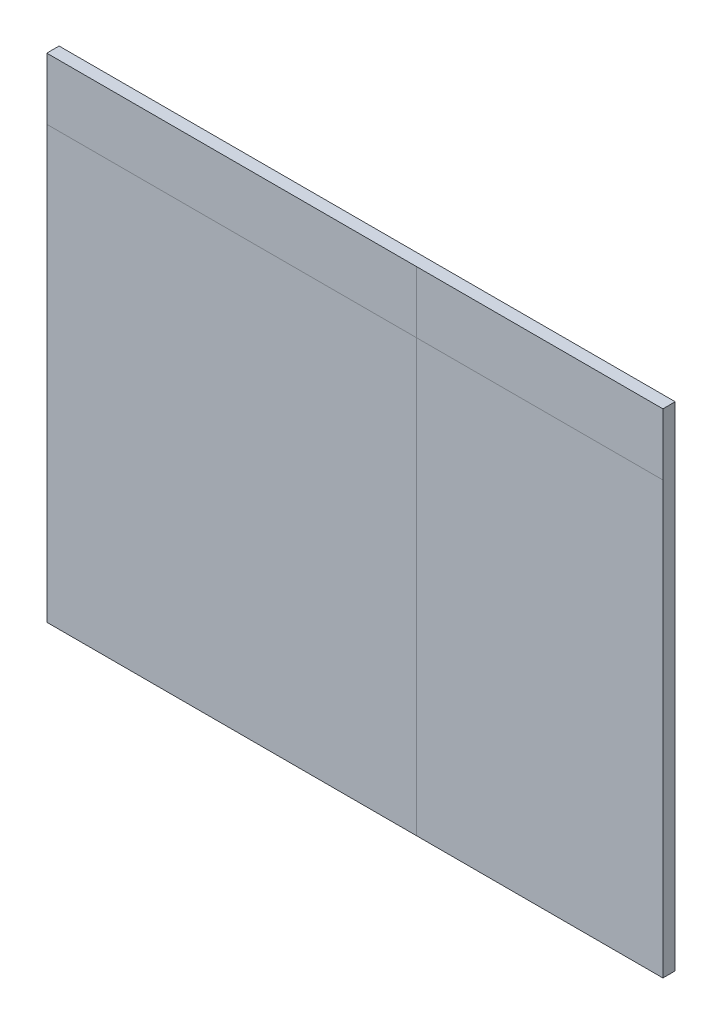
ISO-10303-21;
HEADER;
FILE_DESCRIPTION(('STEP AP214'),'2;1');
FILE_NAME('part.step','',(''),(''),'','','');
FILE_SCHEMA(('AUTOMOTIVE_DESIGN { 1 0 10303 214 1 1 1 1 }'));
ENDSEC;
DATA;
#1=APPLICATION_CONTEXT('core data for automotive mechanical design processes');
#2=APPLICATION_PROTOCOL_DEFINITION('international standard','automotive_design',2000,#1);
#3=PRODUCT_CONTEXT('',#1,'mechanical');
#4=PRODUCT('Part','Part','',(#3));
#5=PRODUCT_RELATED_PRODUCT_CATEGORY('part','',(#4));
#6=PRODUCT_DEFINITION_FORMATION('','',#4);
#7=PRODUCT_DEFINITION_CONTEXT('part definition',#1,'design');
#8=PRODUCT_DEFINITION('design','',#6,#7);
#9=PRODUCT_DEFINITION_SHAPE('','',#8);
#10=(LENGTH_UNIT() NAMED_UNIT(*) SI_UNIT(.MILLI.,.METRE.));
#11=(NAMED_UNIT(*) PLANE_ANGLE_UNIT() SI_UNIT($,.RADIAN.));
#12=(NAMED_UNIT(*) SI_UNIT($,.STERADIAN.) SOLID_ANGLE_UNIT());
#13=UNCERTAINTY_MEASURE_WITH_UNIT(LENGTH_MEASURE(1.E-05),#10,'distance_accuracy_value','');
#14=(GEOMETRIC_REPRESENTATION_CONTEXT(3) GLOBAL_UNCERTAINTY_ASSIGNED_CONTEXT((#13)) GLOBAL_UNIT_ASSIGNED_CONTEXT((#10,
#11,#12)) REPRESENTATION_CONTEXT('',''));
#15=CARTESIAN_POINT('',(0.,0.,0.));
#16=DIRECTION('',(0.,0.,1.));
#17=DIRECTION('',(1.,0.,0.));
#18=AXIS2_PLACEMENT_3D('',#15,#16,#17);
#19=CARTESIAN_POINT('',(-200000.,84553.4737983322,4000.));
#20=DIRECTION('',(0.,0.,1.));
#21=DIRECTION('',(1.,0.,0.));
#22=AXIS2_PLACEMENT_3D('',#19,#20,#21);
#23=PLANE('',#22);
#24=DIRECTION('',(0.,1.,0.));
#25=VECTOR('',#24,1.);
#26=CARTESIAN_POINT('',(8.5265128291212E-11,-75446.5262016678,4000.));
#27=LINE('',#26,#25);
#28=CARTESIAN_POINT('',(8.5265128291212E-11,-75446.5262016678,4000.));
#29=VERTEX_POINT('',#28);
#30=CARTESIAN_POINT('',(8.5265128291212E-11,64553.4738,4000.));
#31=VERTEX_POINT('',#30);
#32=EDGE_CURVE('E139',#29,#31,#27,.T.);
#33=ORIENTED_EDGE('',*,*,#32,.T.);
#34=DIRECTION('',(-1.,0.,0.));
#35=VECTOR('',#34,1.);
#36=CARTESIAN_POINT('',(-200000.,64553.4738,4000.));
#37=LINE('',#36,#35);
#38=CARTESIAN_POINT('',(-80000.,64553.4738,4000.));
#39=VERTEX_POINT('',#38);
#40=EDGE_CURVE('E11',#31,#39,#37,.T.);
#41=ORIENTED_EDGE('',*,*,#40,.T.);
#42=DIRECTION('',(0.,1.,0.));
#43=VECTOR('',#42,1.);
#44=CARTESIAN_POINT('',(-80000.,84553.4737983322,4000.));
#45=LINE('',#44,#43);
#46=CARTESIAN_POINT('',(-80000.,-75446.5262016678,4000.));
#47=VERTEX_POINT('',#46);
#48=EDGE_CURVE('E120',#47,#39,#45,.T.);
#49=ORIENTED_EDGE('',*,*,#48,.F.);
#50=DIRECTION('',(1.,0.,0.));
#51=VECTOR('',#50,1.);
#52=CARTESIAN_POINT('',(8.5265128291212E-11,-75446.5262016678,4000.));
#53=LINE('',#52,#51);
#54=EDGE_CURVE('E110',#47,#29,#53,.T.);
#55=ORIENTED_EDGE('',*,*,#54,.T.);
#56=EDGE_LOOP('',(#33,#41,#49,#55));
#57=FACE_BOUND('',#56,.T.);
#58=ADVANCED_FACE('F39',(#57),#23,.T.);
#59=ORIENTED_EDGE('',*,*,#48,.T.);
#60=DIRECTION('',(-1.,0.,0.));
#61=VECTOR('',#60,1.);
#62=CARTESIAN_POINT('',(-200000.,64553.4738,4000.));
#63=LINE('',#62,#61);
#64=CARTESIAN_POINT('',(-200000.,64553.4738,4000.));
#65=VERTEX_POINT('',#64);
#66=EDGE_CURVE('E43',#39,#65,#63,.T.);
#67=ORIENTED_EDGE('',*,*,#66,.T.);
#68=DIRECTION('',(0.,-1.,0.));
#69=VECTOR('',#68,1.);
#70=CARTESIAN_POINT('',(-200000.,-75446.5262016678,4000.));
#71=LINE('',#70,#69);
#72=CARTESIAN_POINT('',(-200000.,-75446.5262016678,4000.));
#73=VERTEX_POINT('',#72);
#74=EDGE_CURVE('E92',#65,#73,#71,.T.);
#75=ORIENTED_EDGE('',*,*,#74,.T.);
#76=EDGE_CURVE('E95',#73,#47,#53,.T.);
#77=ORIENTED_EDGE('',*,*,#76,.T.);
#78=EDGE_LOOP('',(#59,#67,#75,#77));
#79=FACE_BOUND('',#78,.T.);
#80=ADVANCED_FACE('F94',(#79),#23,.T.);
#81=ORIENTED_EDGE('',*,*,#66,.F.);
#82=CARTESIAN_POINT('',(-80000.,84553.4737983322,4000.));
#83=VERTEX_POINT('',#82);
#84=EDGE_CURVE('E116',#39,#83,#45,.T.);
#85=ORIENTED_EDGE('',*,*,#84,.T.);
#86=DIRECTION('',(-1.,0.,0.));
#87=VECTOR('',#86,1.);
#88=CARTESIAN_POINT('',(8.5265128291212E-11,84553.4737983322,4000.));
#89=LINE('',#88,#87);
#90=CARTESIAN_POINT('',(-200000.,84553.4737983322,4000.));
#91=VERTEX_POINT('',#90);
#92=EDGE_CURVE('E151',#83,#91,#89,.T.);
#93=ORIENTED_EDGE('',*,*,#92,.T.);
#94=EDGE_CURVE('E100',#91,#65,#71,.T.);
#95=ORIENTED_EDGE('',*,*,#94,.T.);
#96=EDGE_LOOP('',(#81,#85,#93,#95));
#97=FACE_BOUND('',#96,.T.);
#98=ADVANCED_FACE('F141',(#97),#23,.T.);
#99=CARTESIAN_POINT('',(-200000.,-75446.5262016678,4000.));
#100=DIRECTION('',(1.,0.,0.));
#101=DIRECTION('',(0.,1.,0.));
#102=AXIS2_PLACEMENT_3D('',#99,#100,#101);
#103=PLANE('',#102);
#104=DIRECTION('',(0.,-1.,0.));
#105=VECTOR('',#104,1.);
#106=CARTESIAN_POINT('',(-200000.,-75446.5262016678,0.));
#107=LINE('',#106,#105);
#108=CARTESIAN_POINT('',(-200000.,84553.4737983322,0.));
#109=VERTEX_POINT('',#108);
#110=CARTESIAN_POINT('',(-200000.,-75446.5262016678,0.));
#111=VERTEX_POINT('',#110);
#112=EDGE_CURVE('E115',#109,#111,#107,.T.);
#113=ORIENTED_EDGE('',*,*,#112,.T.);
#114=DIRECTION('',(0.,0.,-1.));
#115=VECTOR('',#114,1.);
#116=CARTESIAN_POINT('',(-200000.,-75446.5262016678,4000.));
#117=LINE('',#116,#115);
#118=EDGE_CURVE('E107',#73,#111,#117,.T.);
#119=ORIENTED_EDGE('',*,*,#118,.F.);
#120=ORIENTED_EDGE('',*,*,#74,.F.);
#121=ORIENTED_EDGE('',*,*,#94,.F.);
#122=DIRECTION('',(0.,0.,-1.));
#123=VECTOR('',#122,1.);
#124=CARTESIAN_POINT('',(-200000.,84553.4737983322,4000.));
#125=LINE('',#124,#123);
#126=EDGE_CURVE('E150',#91,#109,#125,.T.);
#127=ORIENTED_EDGE('',*,*,#126,.T.);
#128=EDGE_LOOP('',(#113,#119,#120,#121,#127));
#129=FACE_BOUND('',#128,.T.);
#130=ADVANCED_FACE('F41',(#129),#103,.F.);
#131=CARTESIAN_POINT('',(8.5265128291212E-11,-75446.5262016678,4000.));
#132=DIRECTION('',(0.,1.,0.));
#133=DIRECTION('',(-1.,0.,0.));
#134=AXIS2_PLACEMENT_3D('',#131,#132,#133);
#135=PLANE('',#134);
#136=DIRECTION('',(1.,0.,0.));
#137=VECTOR('',#136,1.);
#138=CARTESIAN_POINT('',(8.5265128291212E-11,-75446.5262016678,0.));
#139=LINE('',#138,#137);
#140=CARTESIAN_POINT('',(8.5265128291212E-11,-75446.5262016678,0.));
#141=VERTEX_POINT('',#140);
#142=EDGE_CURVE('E157',#111,#141,#139,.T.);
#143=ORIENTED_EDGE('',*,*,#142,.T.);
#144=DIRECTION('',(0.,0.,-1.));
#145=VECTOR('',#144,1.);
#146=CARTESIAN_POINT('',(8.5265128291212E-11,-75446.5262016678,4000.));
#147=LINE('',#146,#145);
#148=EDGE_CURVE('E117',#29,#141,#147,.T.);
#149=ORIENTED_EDGE('',*,*,#148,.F.);
#150=ORIENTED_EDGE('',*,*,#54,.F.);
#151=ORIENTED_EDGE('',*,*,#76,.F.);
#152=ORIENTED_EDGE('',*,*,#118,.T.);
#153=EDGE_LOOP('',(#143,#149,#150,#151,#152));
#154=FACE_BOUND('',#153,.T.);
#155=ADVANCED_FACE('F106',(#154),#135,.F.);
#156=CARTESIAN_POINT('',(8.5265128291212E-11,-75446.5262016678,4000.));
#157=DIRECTION('',(-1.,0.,0.));
#158=DIRECTION('',(0.,0.,1.));
#159=AXIS2_PLACEMENT_3D('',#156,#157,#158);
#160=PLANE('',#159);
#161=DIRECTION('',(0.,1.,0.));
#162=VECTOR('',#161,1.);
#163=CARTESIAN_POINT('',(8.5265128291212E-11,-75446.5262016678,0.));
#164=LINE('',#163,#162);
#165=CARTESIAN_POINT('',(8.5265128291212E-11,84553.4737983322,0.));
#166=VERTEX_POINT('',#165);
#167=EDGE_CURVE('E159',#141,#166,#164,.T.);
#168=ORIENTED_EDGE('',*,*,#167,.T.);
#169=DIRECTION('',(0.,0.,-1.));
#170=VECTOR('',#169,1.);
#171=CARTESIAN_POINT('',(8.5265128291212E-11,84553.4737983322,4000.));
#172=LINE('',#171,#170);
#173=CARTESIAN_POINT('',(8.5265128291212E-11,84553.4737983322,4000.));
#174=VERTEX_POINT('',#173);
#175=EDGE_CURVE('E123',#174,#166,#172,.T.);
#176=ORIENTED_EDGE('',*,*,#175,.F.);
#177=EDGE_CURVE('E111',#31,#174,#27,.T.);
#178=ORIENTED_EDGE('',*,*,#177,.F.);
#179=ORIENTED_EDGE('',*,*,#32,.F.);
#180=ORIENTED_EDGE('',*,*,#148,.T.);
#181=EDGE_LOOP('',(#168,#176,#178,#179,#180));
#182=FACE_BOUND('',#181,.T.);
#183=ADVANCED_FACE('F168',(#182),#160,.F.);
#184=CARTESIAN_POINT('',(8.5265128291212E-11,84553.4737983322,4000.));
#185=DIRECTION('',(0.,-1.,0.));
#186=DIRECTION('',(1.,0.,0.));
#187=AXIS2_PLACEMENT_3D('',#184,#185,#186);
#188=PLANE('',#187);
#189=DIRECTION('',(-1.,0.,0.));
#190=VECTOR('',#189,1.);
#191=CARTESIAN_POINT('',(8.5265128291212E-11,84553.4737983322,0.));
#192=LINE('',#191,#190);
#193=EDGE_CURVE('E101',#166,#109,#192,.T.);
#194=ORIENTED_EDGE('',*,*,#193,.T.);
#195=ORIENTED_EDGE('',*,*,#126,.F.);
#196=ORIENTED_EDGE('',*,*,#92,.F.);
#197=EDGE_CURVE('E146',#174,#83,#89,.T.);
#198=ORIENTED_EDGE('',*,*,#197,.F.);
#199=ORIENTED_EDGE('',*,*,#175,.T.);
#200=EDGE_LOOP('',(#194,#195,#196,#198,#199));
#201=FACE_BOUND('',#200,.T.);
#202=ADVANCED_FACE('F162',(#201),#188,.F.);
#203=ORIENTED_EDGE('',*,*,#40,.F.);
#204=ORIENTED_EDGE('',*,*,#177,.T.);
#205=ORIENTED_EDGE('',*,*,#197,.T.);
#206=ORIENTED_EDGE('',*,*,#84,.F.);
#207=EDGE_LOOP('',(#203,#204,#205,#206));
#208=FACE_BOUND('',#207,.T.);
#209=ADVANCED_FACE('F144',(#208),#23,.T.);
#210=CARTESIAN_POINT('',(-200000.,84553.4737983322,0.));
#211=DIRECTION('',(0.,0.,1.));
#212=DIRECTION('',(1.,0.,0.));
#213=AXIS2_PLACEMENT_3D('',#210,#211,#212);
#214=PLANE('',#213);
#215=ORIENTED_EDGE('',*,*,#112,.F.);
#216=ORIENTED_EDGE('',*,*,#193,.F.);
#217=ORIENTED_EDGE('',*,*,#167,.F.);
#218=ORIENTED_EDGE('',*,*,#142,.F.);
#219=EDGE_LOOP('',(#215,#216,#217,#218));
#220=FACE_BOUND('',#219,.T.);
#221=ADVANCED_FACE('F167',(#220),#214,.F.);
#222=CLOSED_SHELL('',(#58,#80,#98,#130,#155,#183,#202,#209,#221));
#223=MANIFOLD_SOLID_BREP('B2',#222);
#224=ADVANCED_BREP_SHAPE_REPRESENTATION('',(#18,#223),#14);
#225=SHAPE_DEFINITION_REPRESENTATION(#9,#224);
ENDSEC;
END-ISO-10303-21;
